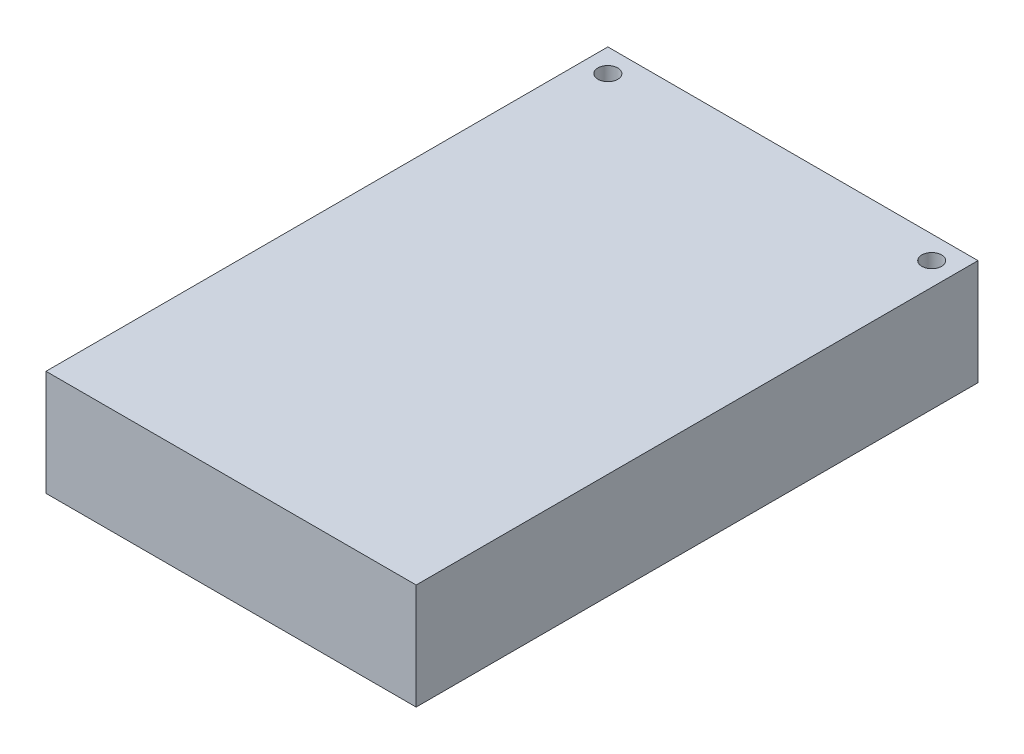
ISO-10303-21;
HEADER;
FILE_DESCRIPTION(('STEP AP214'),'2;1');
FILE_NAME('part.step','',(''),(''),'','','');
FILE_SCHEMA(('AUTOMOTIVE_DESIGN { 1 0 10303 214 1 1 1 1 }'));
ENDSEC;
DATA;
#1=APPLICATION_CONTEXT('core data for automotive mechanical design processes');
#2=APPLICATION_PROTOCOL_DEFINITION('international standard','automotive_design',2000,#1);
#3=PRODUCT_CONTEXT('',#1,'mechanical');
#4=PRODUCT('Part','Part','',(#3));
#5=PRODUCT_RELATED_PRODUCT_CATEGORY('part','',(#4));
#6=PRODUCT_DEFINITION_FORMATION('','',#4);
#7=PRODUCT_DEFINITION_CONTEXT('part definition',#1,'design');
#8=PRODUCT_DEFINITION('design','',#6,#7);
#9=PRODUCT_DEFINITION_SHAPE('','',#8);
#10=(LENGTH_UNIT() NAMED_UNIT(*) SI_UNIT(.MILLI.,.METRE.));
#11=(NAMED_UNIT(*) PLANE_ANGLE_UNIT() SI_UNIT($,.RADIAN.));
#12=(NAMED_UNIT(*) SI_UNIT($,.STERADIAN.) SOLID_ANGLE_UNIT());
#13=UNCERTAINTY_MEASURE_WITH_UNIT(LENGTH_MEASURE(1.E-05),#10,'distance_accuracy_value','');
#14=(GEOMETRIC_REPRESENTATION_CONTEXT(3) GLOBAL_UNCERTAINTY_ASSIGNED_CONTEXT((#13)) GLOBAL_UNIT_ASSIGNED_CONTEXT((#10,
#11,#12)) REPRESENTATION_CONTEXT('',''));
#15=CARTESIAN_POINT('',(0.,0.,0.));
#16=DIRECTION('',(0.,0.,1.));
#17=DIRECTION('',(1.,0.,0.));
#18=AXIS2_PLACEMENT_3D('',#15,#16,#17);
#19=CARTESIAN_POINT('',(0.,0.,85.));
#20=DIRECTION('',(1.,0.,0.));
#21=DIRECTION('',(0.,0.,-1.));
#22=AXIS2_PLACEMENT_3D('',#19,#20,#21);
#23=PLANE('',#22);
#24=DIRECTION('',(0.,-1.,0.));
#25=VECTOR('',#24,1.);
#26=CARTESIAN_POINT('',(0.,0.,0.));
#27=LINE('',#26,#25);
#28=CARTESIAN_POINT('',(0.,16.,0.));
#29=VERTEX_POINT('',#28);
#30=CARTESIAN_POINT('',(0.,0.,0.));
#31=VERTEX_POINT('',#30);
#32=EDGE_CURVE('E106',#29,#31,#27,.T.);
#33=ORIENTED_EDGE('',*,*,#32,.T.);
#34=DIRECTION('',(0.,0.,-1.));
#35=VECTOR('',#34,1.);
#36=CARTESIAN_POINT('',(0.,0.,85.));
#37=LINE('',#36,#35);
#38=CARTESIAN_POINT('',(0.,0.,85.));
#39=VERTEX_POINT('',#38);
#40=EDGE_CURVE('E11',#39,#31,#37,.T.);
#41=ORIENTED_EDGE('',*,*,#40,.F.);
#42=DIRECTION('',(0.,-1.,0.));
#43=VECTOR('',#42,1.);
#44=CARTESIAN_POINT('',(0.,0.,85.));
#45=LINE('',#44,#43);
#46=CARTESIAN_POINT('',(0.,16.,85.));
#47=VERTEX_POINT('',#46);
#48=EDGE_CURVE('E90',#47,#39,#45,.T.);
#49=ORIENTED_EDGE('',*,*,#48,.F.);
#50=DIRECTION('',(0.,0.,-1.));
#51=VECTOR('',#50,1.);
#52=CARTESIAN_POINT('',(0.,16.,85.));
#53=LINE('',#52,#51);
#54=EDGE_CURVE('E102',#47,#29,#53,.T.);
#55=ORIENTED_EDGE('',*,*,#54,.T.);
#56=EDGE_LOOP('',(#33,#41,#49,#55));
#57=FACE_BOUND('',#56,.T.);
#58=ADVANCED_FACE('F38',(#57),#23,.F.);
#59=CARTESIAN_POINT('',(0.,0.,85.));
#60=DIRECTION('',(0.,1.,0.));
#61=DIRECTION('',(0.,0.,1.));
#62=AXIS2_PLACEMENT_3D('',#59,#60,#61);
#63=PLANE('',#62);
#64=CARTESIAN_POINT('',(3.5,0.,3.5));
#65=DIRECTION('',(0.,1.,0.));
#66=DIRECTION('',(0.,0.,1.));
#67=AXIS2_PLACEMENT_3D('',#64,#65,#66);
#68=CIRCLE('',#67,1.5);
#69=CARTESIAN_POINT('',(3.5,0.,5.));
#70=VERTEX_POINT('',#69);
#71=EDGE_CURVE('E110',#70,#70,#68,.T.);
#72=ORIENTED_EDGE('',*,*,#71,.T.);
#73=EDGE_LOOP('',(#72));
#74=FACE_BOUND('',#73,.T.);
#75=CARTESIAN_POINT('',(52.5,0.,3.5));
#76=DIRECTION('',(0.,1.,0.));
#77=DIRECTION('',(0.,0.,1.));
#78=AXIS2_PLACEMENT_3D('',#75,#76,#77);
#79=CIRCLE('',#78,1.5);
#80=CARTESIAN_POINT('',(52.5,0.,5.));
#81=VERTEX_POINT('',#80);
#82=EDGE_CURVE('E131',#81,#81,#79,.T.);
#83=ORIENTED_EDGE('',*,*,#82,.T.);
#84=EDGE_LOOP('',(#83));
#85=FACE_BOUND('',#84,.T.);
#86=DIRECTION('',(1.,0.,0.));
#87=VECTOR('',#86,1.);
#88=CARTESIAN_POINT('',(0.,0.,0.));
#89=LINE('',#88,#87);
#90=CARTESIAN_POINT('',(56.,0.,0.));
#91=VERTEX_POINT('',#90);
#92=EDGE_CURVE('E95',#31,#91,#89,.T.);
#93=ORIENTED_EDGE('',*,*,#92,.T.);
#94=DIRECTION('',(0.,0.,-1.));
#95=VECTOR('',#94,1.);
#96=CARTESIAN_POINT('',(56.,0.,85.));
#97=LINE('',#96,#95);
#98=CARTESIAN_POINT('',(56.,0.,85.));
#99=VERTEX_POINT('',#98);
#100=EDGE_CURVE('E47',#99,#91,#97,.T.);
#101=ORIENTED_EDGE('',*,*,#100,.F.);
#102=DIRECTION('',(1.,0.,0.));
#103=VECTOR('',#102,1.);
#104=CARTESIAN_POINT('',(0.,0.,85.));
#105=LINE('',#104,#103);
#106=EDGE_CURVE('E85',#39,#99,#105,.T.);
#107=ORIENTED_EDGE('',*,*,#106,.F.);
#108=ORIENTED_EDGE('',*,*,#40,.T.);
#109=EDGE_LOOP('',(#93,#101,#107,#108));
#110=FACE_BOUND('',#109,.T.);
#111=ADVANCED_FACE('F94',(#74,#85,#110),#63,.F.);
#112=CARTESIAN_POINT('',(56.,0.,85.));
#113=DIRECTION('',(-1.,0.,0.));
#114=DIRECTION('',(0.,0.,1.));
#115=AXIS2_PLACEMENT_3D('',#112,#113,#114);
#116=PLANE('',#115);
#117=DIRECTION('',(0.,1.,0.));
#118=VECTOR('',#117,1.);
#119=CARTESIAN_POINT('',(56.,0.,0.));
#120=LINE('',#119,#118);
#121=CARTESIAN_POINT('',(56.,16.,0.));
#122=VERTEX_POINT('',#121);
#123=EDGE_CURVE('E72',#91,#122,#120,.T.);
#124=ORIENTED_EDGE('',*,*,#123,.T.);
#125=DIRECTION('',(0.,0.,-1.));
#126=VECTOR('',#125,1.);
#127=CARTESIAN_POINT('',(56.,16.,85.));
#128=LINE('',#127,#126);
#129=CARTESIAN_POINT('',(56.,16.,85.));
#130=VERTEX_POINT('',#129);
#131=EDGE_CURVE('E97',#130,#122,#128,.T.);
#132=ORIENTED_EDGE('',*,*,#131,.F.);
#133=DIRECTION('',(0.,1.,0.));
#134=VECTOR('',#133,1.);
#135=CARTESIAN_POINT('',(56.,0.,85.));
#136=LINE('',#135,#134);
#137=EDGE_CURVE('E88',#99,#130,#136,.T.);
#138=ORIENTED_EDGE('',*,*,#137,.F.);
#139=ORIENTED_EDGE('',*,*,#100,.T.);
#140=EDGE_LOOP('',(#124,#132,#138,#139));
#141=FACE_BOUND('',#140,.T.);
#142=ADVANCED_FACE('F98',(#141),#116,.F.);
#143=CARTESIAN_POINT('',(0.,16.,85.));
#144=DIRECTION('',(0.,-1.,0.));
#145=DIRECTION('',(0.,0.,-1.));
#146=AXIS2_PLACEMENT_3D('',#143,#144,#145);
#147=PLANE('',#146);
#148=CARTESIAN_POINT('',(3.5,16.,3.5));
#149=DIRECTION('',(0.,1.,0.));
#150=DIRECTION('',(0.,0.,1.));
#151=AXIS2_PLACEMENT_3D('',#148,#149,#150);
#152=CIRCLE('',#151,1.5);
#153=CARTESIAN_POINT('',(3.5,16.,5.));
#154=VERTEX_POINT('',#153);
#155=EDGE_CURVE('E135',#154,#154,#152,.T.);
#156=ORIENTED_EDGE('',*,*,#155,.F.);
#157=EDGE_LOOP('',(#156));
#158=FACE_BOUND('',#157,.T.);
#159=CARTESIAN_POINT('',(52.5,16.,3.5));
#160=DIRECTION('',(0.,1.,0.));
#161=DIRECTION('',(0.,0.,1.));
#162=AXIS2_PLACEMENT_3D('',#159,#160,#161);
#163=CIRCLE('',#162,1.5);
#164=CARTESIAN_POINT('',(52.5,16.,5.));
#165=VERTEX_POINT('',#164);
#166=EDGE_CURVE('E127',#165,#165,#163,.T.);
#167=ORIENTED_EDGE('',*,*,#166,.F.);
#168=EDGE_LOOP('',(#167));
#169=FACE_BOUND('',#168,.T.);
#170=DIRECTION('',(-1.,0.,0.));
#171=VECTOR('',#170,1.);
#172=CARTESIAN_POINT('',(0.,16.,0.));
#173=LINE('',#172,#171);
#174=EDGE_CURVE('E78',#122,#29,#173,.T.);
#175=ORIENTED_EDGE('',*,*,#174,.T.);
#176=ORIENTED_EDGE('',*,*,#54,.F.);
#177=DIRECTION('',(-1.,0.,0.));
#178=VECTOR('',#177,1.);
#179=CARTESIAN_POINT('',(0.,16.,85.));
#180=LINE('',#179,#178);
#181=EDGE_CURVE('E55',#130,#47,#180,.T.);
#182=ORIENTED_EDGE('',*,*,#181,.F.);
#183=ORIENTED_EDGE('',*,*,#131,.T.);
#184=EDGE_LOOP('',(#175,#176,#182,#183));
#185=FACE_BOUND('',#184,.T.);
#186=ADVANCED_FACE('F120',(#158,#169,#185),#147,.F.);
#187=CARTESIAN_POINT('',(0.,0.,85.));
#188=DIRECTION('',(0.,0.,-1.));
#189=DIRECTION('',(-1.,0.,0.));
#190=AXIS2_PLACEMENT_3D('',#187,#188,#189);
#191=PLANE('',#190);
#192=ORIENTED_EDGE('',*,*,#48,.T.);
#193=ORIENTED_EDGE('',*,*,#106,.T.);
#194=ORIENTED_EDGE('',*,*,#137,.T.);
#195=ORIENTED_EDGE('',*,*,#181,.T.);
#196=EDGE_LOOP('',(#192,#193,#194,#195));
#197=FACE_BOUND('',#196,.T.);
#198=ADVANCED_FACE('F86',(#197),#191,.F.);
#199=CARTESIAN_POINT('',(0.,0.,0.));
#200=DIRECTION('',(0.,0.,-1.));
#201=DIRECTION('',(-1.,0.,0.));
#202=AXIS2_PLACEMENT_3D('',#199,#200,#201);
#203=PLANE('',#202);
#204=ORIENTED_EDGE('',*,*,#32,.F.);
#205=ORIENTED_EDGE('',*,*,#174,.F.);
#206=ORIENTED_EDGE('',*,*,#123,.F.);
#207=ORIENTED_EDGE('',*,*,#92,.F.);
#208=EDGE_LOOP('',(#204,#205,#206,#207));
#209=FACE_BOUND('',#208,.T.);
#210=ADVANCED_FACE('F123',(#209),#203,.T.);
#211=CARTESIAN_POINT('',(52.5,0.,3.5));
#212=DIRECTION('',(0.,1.,0.));
#213=DIRECTION('',(0.,0.,1.));
#214=AXIS2_PLACEMENT_3D('',#211,#212,#213);
#215=CYLINDRICAL_SURFACE('',#214,1.5);
#216=ORIENTED_EDGE('',*,*,#82,.F.);
#217=EDGE_LOOP('',(#216));
#218=FACE_BOUND('',#217,.T.);
#219=ORIENTED_EDGE('',*,*,#166,.T.);
#220=EDGE_LOOP('',(#219));
#221=FACE_BOUND('',#220,.T.);
#222=ADVANCED_FACE('F148',(#218,#221),#215,.F.);
#223=CARTESIAN_POINT('',(3.5,0.,3.5));
#224=DIRECTION('',(0.,1.,0.));
#225=DIRECTION('',(0.,0.,1.));
#226=AXIS2_PLACEMENT_3D('',#223,#224,#225);
#227=CYLINDRICAL_SURFACE('',#226,1.5);
#228=ORIENTED_EDGE('',*,*,#71,.F.);
#229=EDGE_LOOP('',(#228));
#230=FACE_BOUND('',#229,.T.);
#231=ORIENTED_EDGE('',*,*,#155,.T.);
#232=EDGE_LOOP('',(#231));
#233=FACE_BOUND('',#232,.T.);
#234=ADVANCED_FACE('F145',(#230,#233),#227,.F.);
#235=CLOSED_SHELL('',(#58,#111,#142,#186,#198,#210,#222,#234));
#236=MANIFOLD_SOLID_BREP('B2',#235);
#237=ADVANCED_BREP_SHAPE_REPRESENTATION('',(#18,#236),#14);
#238=SHAPE_DEFINITION_REPRESENTATION(#9,#237);
ENDSEC;
END-ISO-10303-21;
